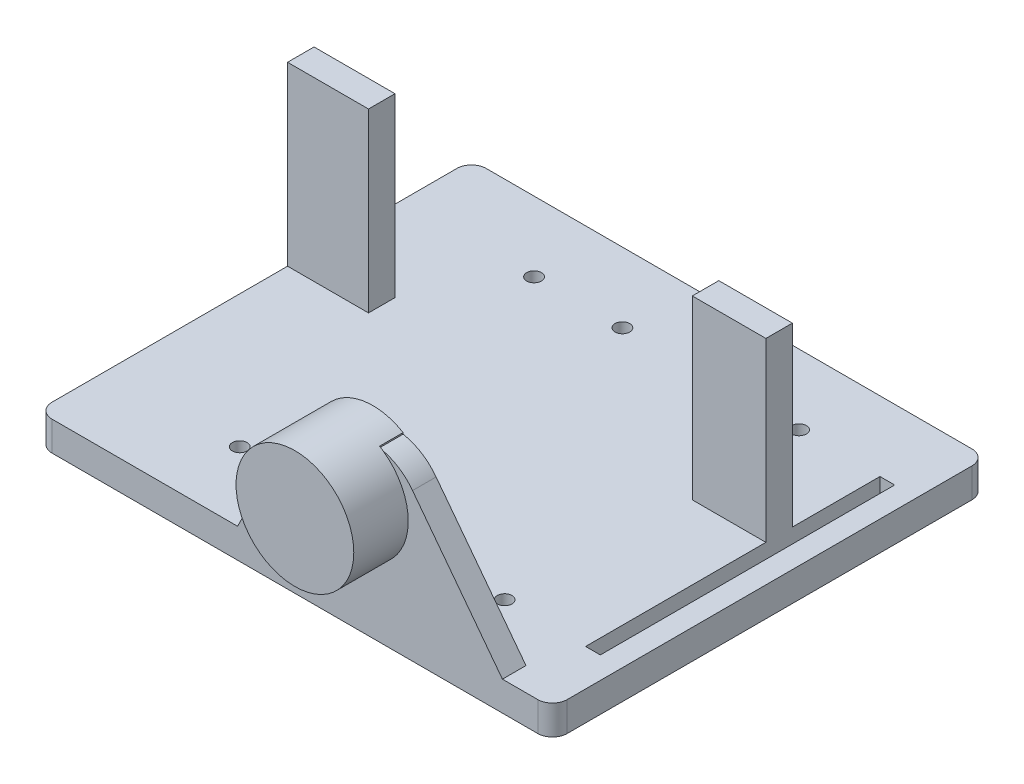
ISO-10303-21;
HEADER;
FILE_DESCRIPTION(('STEP AP214'),'2;1');
FILE_NAME('part.step','',(''),(''),'','','');
FILE_SCHEMA(('AUTOMOTIVE_DESIGN { 1 0 10303 214 1 1 1 1 }'));
ENDSEC;
DATA;
#1=APPLICATION_CONTEXT('core data for automotive mechanical design processes');
#2=APPLICATION_PROTOCOL_DEFINITION('international standard','automotive_design',2000,#1);
#3=PRODUCT_CONTEXT('',#1,'mechanical');
#4=PRODUCT('Part','Part','',(#3));
#5=PRODUCT_RELATED_PRODUCT_CATEGORY('part','',(#4));
#6=PRODUCT_DEFINITION_FORMATION('','',#4);
#7=PRODUCT_DEFINITION_CONTEXT('part definition',#1,'design');
#8=PRODUCT_DEFINITION('design','',#6,#7);
#9=PRODUCT_DEFINITION_SHAPE('','',#8);
#10=(LENGTH_UNIT() NAMED_UNIT(*) SI_UNIT(.MILLI.,.METRE.));
#11=(NAMED_UNIT(*) PLANE_ANGLE_UNIT() SI_UNIT($,.RADIAN.));
#12=(NAMED_UNIT(*) SI_UNIT($,.STERADIAN.) SOLID_ANGLE_UNIT());
#13=UNCERTAINTY_MEASURE_WITH_UNIT(LENGTH_MEASURE(1.E-05),#10,'distance_accuracy_value','');
#14=(GEOMETRIC_REPRESENTATION_CONTEXT(3) GLOBAL_UNCERTAINTY_ASSIGNED_CONTEXT((#13)) GLOBAL_UNIT_ASSIGNED_CONTEXT((#10,
#11,#12)) REPRESENTATION_CONTEXT('',''));
#15=CARTESIAN_POINT('',(0.,0.,0.));
#16=DIRECTION('',(0.,0.,1.));
#17=DIRECTION('',(1.,0.,0.));
#18=AXIS2_PLACEMENT_3D('',#15,#16,#17);
#19=CARTESIAN_POINT('',(5.10000000000002,7.9,13.15));
#20=DIRECTION('',(0.,0.,1.));
#21=DIRECTION('',(1.,0.,0.));
#22=AXIS2_PLACEMENT_3D('',#19,#20,#21);
#23=CYLINDRICAL_SURFACE('',#22,3.6);
#24=CARTESIAN_POINT('',(5.10000000000002,7.9,13.15));
#25=DIRECTION('',(0.,0.,1.));
#26=DIRECTION('',(-1.,0.,0.));
#27=AXIS2_PLACEMENT_3D('',#24,#25,#26);
#28=CIRCLE('',#27,3.6);
#29=CARTESIAN_POINT('',(7.99206413437447,10.043820198306,13.15));
#30=VERTEX_POINT('',#29);
#31=CARTESIAN_POINT('',(5.75081633725553,11.4406832808317,13.15));
#32=VERTEX_POINT('',#31);
#33=EDGE_CURVE('E234',#30,#32,#28,.T.);
#34=ORIENTED_EDGE('',*,*,#33,.T.);
#35=DIRECTION('',(0.,0.,1.));
#36=VECTOR('',#35,1.);
#37=CARTESIAN_POINT('',(5.75081633725553,11.4406832808317,13.15));
#38=LINE('',#37,#36);
#39=CARTESIAN_POINT('',(5.75081633725553,11.4406832808317,14.75));
#40=VERTEX_POINT('',#39);
#41=EDGE_CURVE('E324',#32,#40,#38,.T.);
#42=ORIENTED_EDGE('',*,*,#41,.T.);
#43=CARTESIAN_POINT('',(5.10000000000002,7.9,14.75));
#44=DIRECTION('',(0.,0.,1.));
#45=DIRECTION('',(-1.,0.,0.));
#46=AXIS2_PLACEMENT_3D('',#43,#44,#45);
#47=CIRCLE('',#46,3.6);
#48=CARTESIAN_POINT('',(5.9704543414763,11.3931803903327,14.75));
#49=VERTEX_POINT('',#48);
#50=EDGE_CURVE('E479',#49,#40,#47,.T.);
#51=ORIENTED_EDGE('',*,*,#50,.F.);
#52=CARTESIAN_POINT('',(7.99206413437447,10.043820198306,14.75));
#53=VERTEX_POINT('',#52);
#54=EDGE_CURVE('E475',#53,#49,#47,.T.);
#55=ORIENTED_EDGE('',*,*,#54,.F.);
#56=DIRECTION('',(0.,0.,1.));
#57=VECTOR('',#56,1.);
#58=CARTESIAN_POINT('',(7.99206413437447,10.043820198306,13.15));
#59=LINE('',#58,#57);
#60=EDGE_CURVE('E233',#30,#53,#59,.T.);
#61=ORIENTED_EDGE('',*,*,#60,.F.);
#62=EDGE_LOOP('',(#34,#42,#51,#55,#61));
#63=FACE_BOUND('',#62,.T.);
#64=ADVANCED_FACE('F33',(#63),#23,.T.);
#65=CARTESIAN_POINT('',(3.70000000000003,8.10000000000007,14.75));
#66=DIRECTION('',(0.,0.,1.));
#67=DIRECTION('',(1.,0.,0.));
#68=AXIS2_PLACEMENT_3D('',#65,#66,#67);
#69=PLANE('',#68);
#70=DIRECTION('',(0.,-1.,0.));
#71=VECTOR('',#70,1.);
#72=CARTESIAN_POINT('',(5.75081633725553,11.5342615437451,14.75));
#73=LINE('',#72,#71);
#74=CARTESIAN_POINT('',(5.75081633725553,11.5342615437451,14.75));
#75=VERTEX_POINT('',#74);
#76=EDGE_CURVE('E223',#75,#40,#73,.T.);
#77=ORIENTED_EDGE('',*,*,#76,.F.);
#78=CARTESIAN_POINT('',(3.70000000000003,8.10000000000007,14.75));
#79=DIRECTION('',(0.,0.,1.));
#80=DIRECTION('',(1.,0.,0.));
#81=AXIS2_PLACEMENT_3D('',#78,#79,#80);
#82=CIRCLE('',#81,4.);
#83=EDGE_CURVE('E467',#49,#75,#82,.T.);
#84=ORIENTED_EDGE('',*,*,#83,.F.);
#85=ORIENTED_EDGE('',*,*,#50,.T.);
#86=EDGE_LOOP('',(#77,#84,#85));
#87=FACE_BOUND('',#86,.T.);
#88=ADVANCED_FACE('F486',(#87),#69,.F.);
#89=CARTESIAN_POINT('',(0.,2.,0.));
#90=DIRECTION('',(0.,-1.,0.));
#91=DIRECTION('',(0.,0.,-1.));
#92=AXIS2_PLACEMENT_3D('',#89,#90,#91);
#93=PLANE('',#92);
#94=CARTESIAN_POINT('',(-2.50000000000006,2.,10.));
#95=DIRECTION('',(0.,-1.,0.));
#96=DIRECTION('',(0.,0.,-1.));
#97=AXIS2_PLACEMENT_3D('',#94,#95,#96);
#98=CIRCLE('',#97,0.500490026682158);
#99=CARTESIAN_POINT('',(-2.50000000000006,2.,9.49950997331784));
#100=VERTEX_POINT('',#99);
#101=EDGE_CURVE('E372',#100,#100,#98,.T.);
#102=ORIENTED_EDGE('',*,*,#101,.T.);
#103=EDGE_LOOP('',(#102));
#104=FACE_BOUND('',#103,.T.);
#105=CARTESIAN_POINT('',(9.50000000000002,2.,-10.));
#106=DIRECTION('',(0.,-1.,0.));
#107=DIRECTION('',(0.,0.,-1.));
#108=AXIS2_PLACEMENT_3D('',#105,#106,#107);
#109=CIRCLE('',#108,0.500490026682158);
#110=CARTESIAN_POINT('',(9.50000000000002,2.,-10.5004900266822));
#111=VERTEX_POINT('',#110);
#112=EDGE_CURVE('E369',#111,#111,#109,.T.);
#113=ORIENTED_EDGE('',*,*,#112,.T.);
#114=EDGE_LOOP('',(#113));
#115=FACE_BOUND('',#114,.T.);
#116=CARTESIAN_POINT('',(3.50000000000001,2.,-10.));
#117=DIRECTION('',(0.,-1.,0.));
#118=DIRECTION('',(0.,0.,-1.));
#119=AXIS2_PLACEMENT_3D('',#116,#117,#118);
#120=CIRCLE('',#119,0.500490026682158);
#121=CARTESIAN_POINT('',(3.50000000000001,2.,-10.5004900266822));
#122=VERTEX_POINT('',#121);
#123=EDGE_CURVE('E366',#122,#122,#120,.T.);
#124=ORIENTED_EDGE('',*,*,#123,.T.);
#125=EDGE_LOOP('',(#124));
#126=FACE_BOUND('',#125,.T.);
#127=CARTESIAN_POINT('',(-2.49999999999999,2.,-10.));
#128=DIRECTION('',(0.,-1.,0.));
#129=DIRECTION('',(0.,0.,-1.));
#130=AXIS2_PLACEMENT_3D('',#127,#128,#129);
#131=CIRCLE('',#130,0.500490026682158);
#132=CARTESIAN_POINT('',(-2.49999999999999,2.,-10.5004900266822));
#133=VERTEX_POINT('',#132);
#134=EDGE_CURVE('E363',#133,#133,#131,.T.);
#135=ORIENTED_EDGE('',*,*,#134,.T.);
#136=EDGE_LOOP('',(#135));
#137=FACE_BOUND('',#136,.T.);
#138=CARTESIAN_POINT('',(3.49999999999994,2.,10.));
#139=DIRECTION('',(0.,-1.,0.));
#140=DIRECTION('',(0.,0.,-1.));
#141=AXIS2_PLACEMENT_3D('',#138,#139,#140);
#142=CIRCLE('',#141,0.500490026682158);
#143=CARTESIAN_POINT('',(3.49999999999994,2.,9.49950997331784));
#144=VERTEX_POINT('',#143);
#145=EDGE_CURVE('E360',#144,#144,#142,.T.);
#146=ORIENTED_EDGE('',*,*,#145,.T.);
#147=EDGE_LOOP('',(#146));
#148=FACE_BOUND('',#147,.T.);
#149=CARTESIAN_POINT('',(9.49999999999995,2.,10.));
#150=DIRECTION('',(0.,-1.,0.));
#151=DIRECTION('',(0.,0.,-1.));
#152=AXIS2_PLACEMENT_3D('',#149,#150,#151);
#153=CIRCLE('',#152,0.500490026682158);
#154=CARTESIAN_POINT('',(9.49999999999995,2.,9.49950997331784));
#155=VERTEX_POINT('',#154);
#156=EDGE_CURVE('E357',#155,#155,#153,.T.);
#157=ORIENTED_EDGE('',*,*,#156,.T.);
#158=EDGE_LOOP('',(#157));
#159=FACE_BOUND('',#158,.T.);
#160=CARTESIAN_POINT('',(-8.50000000000006,2.,10.));
#161=DIRECTION('',(0.,-1.,0.));
#162=DIRECTION('',(0.,0.,-1.));
#163=AXIS2_PLACEMENT_3D('',#160,#161,#162);
#164=CIRCLE('',#163,0.500490026682158);
#165=CARTESIAN_POINT('',(-8.50000000000006,2.,9.49950997331784));
#166=VERTEX_POINT('',#165);
#167=EDGE_CURVE('E354',#166,#166,#164,.T.);
#168=ORIENTED_EDGE('',*,*,#167,.T.);
#169=EDGE_LOOP('',(#168));
#170=FACE_BOUND('',#169,.T.);
#171=CARTESIAN_POINT('',(-8.49999999999999,2.,-10.));
#172=DIRECTION('',(0.,-1.,0.));
#173=DIRECTION('',(0.,0.,-1.));
#174=AXIS2_PLACEMENT_3D('',#171,#172,#173);
#175=CIRCLE('',#174,0.500490026682158);
#176=CARTESIAN_POINT('',(-8.49999999999999,2.,-10.5004900266822));
#177=VERTEX_POINT('',#176);
#178=EDGE_CURVE('E351',#177,#177,#175,.T.);
#179=ORIENTED_EDGE('',*,*,#178,.T.);
#180=EDGE_LOOP('',(#179));
#181=FACE_BOUND('',#180,.T.);
#182=DIRECTION('',(0.,0.,-1.));
#183=VECTOR('',#182,1.);
#184=CARTESIAN_POINT('',(17.5,2.,14.75));
#185=LINE('',#184,#183);
#186=CARTESIAN_POINT('',(17.5,2.,13.75));
#187=VERTEX_POINT('',#186);
#188=CARTESIAN_POINT('',(17.5,2.,-13.75));
#189=VERTEX_POINT('',#188);
#190=EDGE_CURVE('E248',#187,#189,#185,.T.);
#191=ORIENTED_EDGE('',*,*,#190,.T.);
#192=CARTESIAN_POINT('',(16.5,2.,-13.75));
#193=DIRECTION('',(0.,-1.,0.));
#194=DIRECTION('',(0.,0.,-1.));
#195=AXIS2_PLACEMENT_3D('',#192,#193,#194);
#196=CIRCLE('',#195,1.);
#197=CARTESIAN_POINT('',(16.5,2.,-14.75));
#198=VERTEX_POINT('',#197);
#199=EDGE_CURVE('E291',#189,#198,#196,.F.);
#200=ORIENTED_EDGE('',*,*,#199,.T.);
#201=DIRECTION('',(-1.,0.,0.));
#202=VECTOR('',#201,1.);
#203=CARTESIAN_POINT('',(-17.5,2.,-14.75));
#204=LINE('',#203,#202);
#205=CARTESIAN_POINT('',(-16.5,2.,-14.75));
#206=VERTEX_POINT('',#205);
#207=EDGE_CURVE('E250',#198,#206,#204,.T.);
#208=ORIENTED_EDGE('',*,*,#207,.T.);
#209=CARTESIAN_POINT('',(-16.5,2.,-13.75));
#210=DIRECTION('',(0.,-1.,0.));
#211=DIRECTION('',(0.,0.,-1.));
#212=AXIS2_PLACEMENT_3D('',#209,#210,#211);
#213=CIRCLE('',#212,1.);
#214=CARTESIAN_POINT('',(-17.5,2.,-13.75));
#215=VERTEX_POINT('',#214);
#216=EDGE_CURVE('E48',#206,#215,#213,.F.);
#217=ORIENTED_EDGE('',*,*,#216,.T.);
#218=DIRECTION('',(0.,0.,1.));
#219=VECTOR('',#218,1.);
#220=CARTESIAN_POINT('',(-17.5,2.,14.75));
#221=LINE('',#220,#219);
#222=CARTESIAN_POINT('',(-17.5,2.,-4.05));
#223=VERTEX_POINT('',#222);
#224=EDGE_CURVE('E254',#215,#223,#221,.T.);
#225=ORIENTED_EDGE('',*,*,#224,.T.);
#226=DIRECTION('',(-1.,0.,0.));
#227=VECTOR('',#226,1.);
#228=CARTESIAN_POINT('',(-17.5,2.,-4.05));
#229=LINE('',#228,#227);
#230=CARTESIAN_POINT('',(-12.,2.,-4.05));
#231=VERTEX_POINT('',#230);
#232=EDGE_CURVE('E443',#231,#223,#229,.T.);
#233=ORIENTED_EDGE('',*,*,#232,.F.);
#234=DIRECTION('',(0.,0.,-1.));
#235=VECTOR('',#234,1.);
#236=CARTESIAN_POINT('',(-12.,2.,-2.25));
#237=LINE('',#236,#235);
#238=CARTESIAN_POINT('',(-12.,2.,-2.25));
#239=VERTEX_POINT('',#238);
#240=EDGE_CURVE('E452',#239,#231,#237,.T.);
#241=ORIENTED_EDGE('',*,*,#240,.F.);
#242=DIRECTION('',(1.,0.,0.));
#243=VECTOR('',#242,1.);
#244=CARTESIAN_POINT('',(-17.5,2.,-2.25));
#245=LINE('',#244,#243);
#246=CARTESIAN_POINT('',(-17.5,2.,-2.25));
#247=VERTEX_POINT('',#246);
#248=EDGE_CURVE('E438',#247,#239,#245,.T.);
#249=ORIENTED_EDGE('',*,*,#248,.F.);
#250=CARTESIAN_POINT('',(-17.5,2.,13.75));
#251=VERTEX_POINT('',#250);
#252=EDGE_CURVE('E253',#247,#251,#221,.T.);
#253=ORIENTED_EDGE('',*,*,#252,.T.);
#254=CARTESIAN_POINT('',(-16.5,2.,13.75));
#255=DIRECTION('',(0.,-1.,0.));
#256=DIRECTION('',(0.,0.,-1.));
#257=AXIS2_PLACEMENT_3D('',#254,#255,#256);
#258=CIRCLE('',#257,1.);
#259=CARTESIAN_POINT('',(-16.5,2.,14.75));
#260=VERTEX_POINT('',#259);
#261=EDGE_CURVE('E287',#251,#260,#258,.F.);
#262=ORIENTED_EDGE('',*,*,#261,.T.);
#263=DIRECTION('',(1.,0.,0.));
#264=VECTOR('',#263,1.);
#265=CARTESIAN_POINT('',(-17.5,2.,14.75));
#266=LINE('',#265,#264);
#267=CARTESIAN_POINT('',(-3.89999999999998,2.,14.75));
#268=VERTEX_POINT('',#267);
#269=EDGE_CURVE('E240',#260,#268,#266,.T.);
#270=ORIENTED_EDGE('',*,*,#269,.T.);
#271=DIRECTION('',(0.,0.,1.));
#272=VECTOR('',#271,1.);
#273=CARTESIAN_POINT('',(-3.89999999999998,2.,13.15));
#274=LINE('',#273,#272);
#275=CARTESIAN_POINT('',(-3.89999999999998,2.,13.15));
#276=VERTEX_POINT('',#275);
#277=EDGE_CURVE('E216',#276,#268,#274,.T.);
#278=ORIENTED_EDGE('',*,*,#277,.F.);
#279=DIRECTION('',(1.,0.,0.));
#280=VECTOR('',#279,1.);
#281=CARTESIAN_POINT('',(14.1,2.,13.15));
#282=LINE('',#281,#280);
#283=CARTESIAN_POINT('',(14.1,2.,13.15));
#284=VERTEX_POINT('',#283);
#285=EDGE_CURVE('E226',#276,#284,#282,.T.);
#286=ORIENTED_EDGE('',*,*,#285,.T.);
#287=DIRECTION('',(0.,0.,1.));
#288=VECTOR('',#287,1.);
#289=CARTESIAN_POINT('',(14.1,2.,13.15));
#290=LINE('',#289,#288);
#291=CARTESIAN_POINT('',(14.1,2.,14.75));
#292=VERTEX_POINT('',#291);
#293=EDGE_CURVE('E241',#284,#292,#290,.T.);
#294=ORIENTED_EDGE('',*,*,#293,.T.);
#295=CARTESIAN_POINT('',(16.5,2.,14.75));
#296=VERTEX_POINT('',#295);
#297=EDGE_CURVE('E256',#292,#296,#266,.T.);
#298=ORIENTED_EDGE('',*,*,#297,.T.);
#299=CARTESIAN_POINT('',(16.5,2.,13.75));
#300=DIRECTION('',(0.,-1.,0.));
#301=DIRECTION('',(0.,0.,-1.));
#302=AXIS2_PLACEMENT_3D('',#299,#300,#301);
#303=CIRCLE('',#302,1.);
#304=EDGE_CURVE('E289',#296,#187,#303,.F.);
#305=ORIENTED_EDGE('',*,*,#304,.T.);
#306=EDGE_LOOP('',(#191,#200,#208,#217,#225,#233,#241,#249,#253,#262,#270,#278,#286,#294,#298,#305));
#307=FACE_BOUND('',#306,.T.);
#308=DIRECTION('',(1.,0.,0.));
#309=VECTOR('',#308,1.);
#310=CARTESIAN_POINT('',(15.,2.,10.));
#311=LINE('',#310,#309);
#312=CARTESIAN_POINT('',(15.,2.,10.));
#313=VERTEX_POINT('',#312);
#314=CARTESIAN_POINT('',(16.,2.,10.));
#315=VERTEX_POINT('',#314);
#316=EDGE_CURVE('E375',#313,#315,#311,.T.);
#317=ORIENTED_EDGE('',*,*,#316,.F.);
#318=DIRECTION('',(0.,0.,1.));
#319=VECTOR('',#318,1.);
#320=CARTESIAN_POINT('',(15.,2.,10.));
#321=LINE('',#320,#319);
#322=CARTESIAN_POINT('',(15.,2.,-2.25));
#323=VERTEX_POINT('',#322);
#324=EDGE_CURVE('E398',#323,#313,#321,.T.);
#325=ORIENTED_EDGE('',*,*,#324,.F.);
#326=DIRECTION('',(1.,0.,0.));
#327=VECTOR('',#326,1.);
#328=CARTESIAN_POINT('',(10.,2.,-2.25));
#329=LINE('',#328,#327);
#330=CARTESIAN_POINT('',(10.,2.,-2.25));
#331=VERTEX_POINT('',#330);
#332=EDGE_CURVE('E413',#331,#323,#329,.T.);
#333=ORIENTED_EDGE('',*,*,#332,.F.);
#334=DIRECTION('',(0.,0.,1.));
#335=VECTOR('',#334,1.);
#336=CARTESIAN_POINT('',(10.,2.,-2.25));
#337=LINE('',#336,#335);
#338=CARTESIAN_POINT('',(10.,2.,-4.05));
#339=VERTEX_POINT('',#338);
#340=EDGE_CURVE('E422',#339,#331,#337,.T.);
#341=ORIENTED_EDGE('',*,*,#340,.F.);
#342=DIRECTION('',(-1.,0.,0.));
#343=VECTOR('',#342,1.);
#344=CARTESIAN_POINT('',(10.,2.,-4.05));
#345=LINE('',#344,#343);
#346=CARTESIAN_POINT('',(15.,2.,-4.05));
#347=VERTEX_POINT('',#346);
#348=EDGE_CURVE('E403',#347,#339,#345,.T.);
#349=ORIENTED_EDGE('',*,*,#348,.F.);
#350=CARTESIAN_POINT('',(15.,2.,-10.));
#351=VERTEX_POINT('',#350);
#352=EDGE_CURVE('E380',#351,#347,#321,.T.);
#353=ORIENTED_EDGE('',*,*,#352,.F.);
#354=DIRECTION('',(-1.,0.,0.));
#355=VECTOR('',#354,1.);
#356=CARTESIAN_POINT('',(15.,2.,-10.));
#357=LINE('',#356,#355);
#358=CARTESIAN_POINT('',(16.,2.,-10.));
#359=VERTEX_POINT('',#358);
#360=EDGE_CURVE('E395',#359,#351,#357,.T.);
#361=ORIENTED_EDGE('',*,*,#360,.F.);
#362=DIRECTION('',(0.,0.,-1.));
#363=VECTOR('',#362,1.);
#364=CARTESIAN_POINT('',(16.,2.,-10.));
#365=LINE('',#364,#363);
#366=EDGE_CURVE('E392',#315,#359,#365,.T.);
#367=ORIENTED_EDGE('',*,*,#366,.F.);
#368=EDGE_LOOP('',(#317,#325,#333,#341,#349,#353,#361,#367));
#369=FACE_BOUND('',#368,.T.);
#370=ADVANCED_FACE('F237',(#104,#115,#126,#137,#148,#159,#170,#181,#307,#369),#93,.F.);
#371=CARTESIAN_POINT('',(17.5,2.,14.75));
#372=DIRECTION('',(-1.,0.,0.));
#373=DIRECTION('',(0.,0.,1.));
#374=AXIS2_PLACEMENT_3D('',#371,#372,#373);
#375=PLANE('',#374);
#376=DIRECTION('',(0.,0.,-1.));
#377=VECTOR('',#376,1.);
#378=CARTESIAN_POINT('',(17.5,0.,14.75));
#379=LINE('',#378,#377);
#380=CARTESIAN_POINT('',(17.5,0.,13.75));
#381=VERTEX_POINT('',#380);
#382=CARTESIAN_POINT('',(17.5,0.,-13.75));
#383=VERTEX_POINT('',#382);
#384=EDGE_CURVE('E243',#381,#383,#379,.T.);
#385=ORIENTED_EDGE('',*,*,#384,.T.);
#386=DIRECTION('',(0.,-1.,0.));
#387=VECTOR('',#386,1.);
#388=CARTESIAN_POINT('',(17.5,2.,-13.75));
#389=LINE('',#388,#387);
#390=EDGE_CURVE('E284',#383,#189,#389,.F.);
#391=ORIENTED_EDGE('',*,*,#390,.T.);
#392=ORIENTED_EDGE('',*,*,#190,.F.);
#393=DIRECTION('',(0.,-1.,0.));
#394=VECTOR('',#393,1.);
#395=CARTESIAN_POINT('',(17.5,2.,13.75));
#396=LINE('',#395,#394);
#397=EDGE_CURVE('E281',#187,#381,#396,.T.);
#398=ORIENTED_EDGE('',*,*,#397,.T.);
#399=EDGE_LOOP('',(#385,#391,#392,#398));
#400=FACE_BOUND('',#399,.T.);
#401=ADVANCED_FACE('F521',(#400),#375,.F.);
#402=CARTESIAN_POINT('',(-17.5,2.,-14.75));
#403=DIRECTION('',(0.,0.,1.));
#404=DIRECTION('',(1.,0.,0.));
#405=AXIS2_PLACEMENT_3D('',#402,#403,#404);
#406=PLANE('',#405);
#407=ORIENTED_EDGE('',*,*,#207,.F.);
#408=DIRECTION('',(0.,-1.,0.));
#409=VECTOR('',#408,1.);
#410=CARTESIAN_POINT('',(16.5,2.,-14.75));
#411=LINE('',#410,#409);
#412=CARTESIAN_POINT('',(16.5,0.,-14.75));
#413=VERTEX_POINT('',#412);
#414=EDGE_CURVE('E270',#198,#413,#411,.T.);
#415=ORIENTED_EDGE('',*,*,#414,.T.);
#416=DIRECTION('',(-1.,0.,0.));
#417=VECTOR('',#416,1.);
#418=CARTESIAN_POINT('',(-17.5,0.,-14.75));
#419=LINE('',#418,#417);
#420=CARTESIAN_POINT('',(-16.5,0.,-14.75));
#421=VERTEX_POINT('',#420);
#422=EDGE_CURVE('E261',#413,#421,#419,.T.);
#423=ORIENTED_EDGE('',*,*,#422,.T.);
#424=DIRECTION('',(0.,-1.,0.));
#425=VECTOR('',#424,1.);
#426=CARTESIAN_POINT('',(-16.5,2.,-14.75));
#427=LINE('',#426,#425);
#428=EDGE_CURVE('E268',#421,#206,#427,.F.);
#429=ORIENTED_EDGE('',*,*,#428,.T.);
#430=EDGE_LOOP('',(#407,#415,#423,#429));
#431=FACE_BOUND('',#430,.T.);
#432=ADVANCED_FACE('F530',(#431),#406,.F.);
#433=CARTESIAN_POINT('',(-17.5,2.,14.75));
#434=DIRECTION('',(1.,0.,0.));
#435=DIRECTION('',(0.,0.,-1.));
#436=AXIS2_PLACEMENT_3D('',#433,#434,#435);
#437=PLANE('',#436);
#438=DIRECTION('',(0.,0.,1.));
#439=VECTOR('',#438,1.);
#440=CARTESIAN_POINT('',(-17.5,0.,14.75));
#441=LINE('',#440,#439);
#442=CARTESIAN_POINT('',(-17.5,0.,-13.75));
#443=VERTEX_POINT('',#442);
#444=CARTESIAN_POINT('',(-17.5,0.,13.75));
#445=VERTEX_POINT('',#444);
#446=EDGE_CURVE('E264',#443,#445,#441,.T.);
#447=ORIENTED_EDGE('',*,*,#446,.T.);
#448=DIRECTION('',(0.,-1.,0.));
#449=VECTOR('',#448,1.);
#450=CARTESIAN_POINT('',(-17.5,2.,13.75));
#451=LINE('',#450,#449);
#452=EDGE_CURVE('E11',#445,#251,#451,.F.);
#453=ORIENTED_EDGE('',*,*,#452,.T.);
#454=ORIENTED_EDGE('',*,*,#252,.F.);
#455=DIRECTION('',(0.,-1.,0.));
#456=VECTOR('',#455,1.);
#457=CARTESIAN_POINT('',(-17.5,14.,-2.25));
#458=LINE('',#457,#456);
#459=CARTESIAN_POINT('',(-17.5,14.,-2.25));
#460=VERTEX_POINT('',#459);
#461=EDGE_CURVE('E464',#460,#247,#458,.T.);
#462=ORIENTED_EDGE('',*,*,#461,.F.);
#463=DIRECTION('',(0.,0.,1.));
#464=VECTOR('',#463,1.);
#465=CARTESIAN_POINT('',(-17.5,14.,-2.25));
#466=LINE('',#465,#464);
#467=CARTESIAN_POINT('',(-17.5,14.,-4.05));
#468=VERTEX_POINT('',#467);
#469=EDGE_CURVE('E439',#468,#460,#466,.T.);
#470=ORIENTED_EDGE('',*,*,#469,.F.);
#471=DIRECTION('',(0.,-1.,0.));
#472=VECTOR('',#471,1.);
#473=CARTESIAN_POINT('',(-17.5,14.,-4.05));
#474=LINE('',#473,#472);
#475=EDGE_CURVE('E449',#468,#223,#474,.T.);
#476=ORIENTED_EDGE('',*,*,#475,.T.);
#477=ORIENTED_EDGE('',*,*,#224,.F.);
#478=DIRECTION('',(0.,-1.,0.));
#479=VECTOR('',#478,1.);
#480=CARTESIAN_POINT('',(-17.5,2.,-13.75));
#481=LINE('',#480,#479);
#482=EDGE_CURVE('E41',#215,#443,#481,.T.);
#483=ORIENTED_EDGE('',*,*,#482,.T.);
#484=EDGE_LOOP('',(#447,#453,#454,#462,#470,#476,#477,#483));
#485=FACE_BOUND('',#484,.T.);
#486=ADVANCED_FACE('F300',(#485),#437,.F.);
#487=CARTESIAN_POINT('',(-17.5,2.,14.75));
#488=DIRECTION('',(0.,0.,-1.));
#489=DIRECTION('',(-1.,0.,0.));
#490=AXIS2_PLACEMENT_3D('',#487,#488,#489);
#491=PLANE('',#490);
#492=CARTESIAN_POINT('',(0.0522292944323392,9.7412705077477,14.75));
#493=VERTEX_POINT('',#492);
#494=EDGE_CURVE('E258',#493,#49,#82,.T.);
#495=ORIENTED_EDGE('',*,*,#494,.F.);
#496=DIRECTION('',(0.45470780974407,0.890640672638383,0.));
#497=VECTOR('',#496,1.);
#498=CARTESIAN_POINT('',(-3.89999999999998,2.,14.75));
#499=LINE('',#498,#497);
#500=EDGE_CURVE('E313',#268,#493,#499,.T.);
#501=ORIENTED_EDGE('',*,*,#500,.F.);
#502=ORIENTED_EDGE('',*,*,#269,.F.);
#503=DIRECTION('',(0.,-1.,0.));
#504=VECTOR('',#503,1.);
#505=CARTESIAN_POINT('',(-16.5,2.,14.75));
#506=LINE('',#505,#504);
#507=CARTESIAN_POINT('',(-16.5,0.,14.75));
#508=VERTEX_POINT('',#507);
#509=EDGE_CURVE('E293',#260,#508,#506,.T.);
#510=ORIENTED_EDGE('',*,*,#509,.T.);
#511=DIRECTION('',(1.,0.,0.));
#512=VECTOR('',#511,1.);
#513=CARTESIAN_POINT('',(-17.5,0.,14.75));
#514=LINE('',#513,#512);
#515=CARTESIAN_POINT('',(16.5,0.,14.75));
#516=VERTEX_POINT('',#515);
#517=EDGE_CURVE('E251',#508,#516,#514,.T.);
#518=ORIENTED_EDGE('',*,*,#517,.T.);
#519=DIRECTION('',(0.,-1.,0.));
#520=VECTOR('',#519,1.);
#521=CARTESIAN_POINT('',(16.5,2.,14.75));
#522=LINE('',#521,#520);
#523=EDGE_CURVE('E56',#516,#296,#522,.F.);
#524=ORIENTED_EDGE('',*,*,#523,.T.);
#525=ORIENTED_EDGE('',*,*,#297,.F.);
#526=DIRECTION('',(-0.604746350818441,0.796418138399534,0.));
#527=VECTOR('',#526,1.);
#528=CARTESIAN_POINT('',(14.1,2.,14.75));
#529=LINE('',#528,#527);
#530=EDGE_CURVE('E471',#292,#53,#529,.T.);
#531=ORIENTED_EDGE('',*,*,#530,.T.);
#532=ORIENTED_EDGE('',*,*,#54,.T.);
#533=EDGE_LOOP('',(#495,#501,#502,#510,#518,#524,#525,#531,#532));
#534=FACE_BOUND('',#533,.T.);
#535=ADVANCED_FACE('F312',(#534),#491,.F.);
#536=CARTESIAN_POINT('',(0.,0.,0.));
#537=DIRECTION('',(0.,-1.,0.));
#538=DIRECTION('',(0.,0.,-1.));
#539=AXIS2_PLACEMENT_3D('',#536,#537,#538);
#540=PLANE('',#539);
#541=CARTESIAN_POINT('',(-2.50000000000006,0.,10.));
#542=DIRECTION('',(0.,-1.,0.));
#543=DIRECTION('',(0.,0.,-1.));
#544=AXIS2_PLACEMENT_3D('',#541,#542,#543);
#545=CIRCLE('',#544,0.500490026682158);
#546=CARTESIAN_POINT('',(-2.50000000000006,0.,9.49950997331784));
#547=VERTEX_POINT('',#546);
#548=EDGE_CURVE('E331',#547,#547,#545,.T.);
#549=ORIENTED_EDGE('',*,*,#548,.F.);
#550=EDGE_LOOP('',(#549));
#551=FACE_BOUND('',#550,.T.);
#552=CARTESIAN_POINT('',(9.50000000000002,0.,-10.));
#553=DIRECTION('',(0.,-1.,0.));
#554=DIRECTION('',(0.,0.,-1.));
#555=AXIS2_PLACEMENT_3D('',#552,#553,#554);
#556=CIRCLE('',#555,0.500490026682158);
#557=CARTESIAN_POINT('',(9.50000000000002,0.,-10.5004900266822));
#558=VERTEX_POINT('',#557);
#559=EDGE_CURVE('E337',#558,#558,#556,.T.);
#560=ORIENTED_EDGE('',*,*,#559,.F.);
#561=EDGE_LOOP('',(#560));
#562=FACE_BOUND('',#561,.T.);
#563=CARTESIAN_POINT('',(3.50000000000001,0.,-10.));
#564=DIRECTION('',(0.,-1.,0.));
#565=DIRECTION('',(0.,0.,-1.));
#566=AXIS2_PLACEMENT_3D('',#563,#564,#565);
#567=CIRCLE('',#566,0.500490026682158);
#568=CARTESIAN_POINT('',(3.50000000000001,0.,-10.5004900266822));
#569=VERTEX_POINT('',#568);
#570=EDGE_CURVE('E340',#569,#569,#567,.T.);
#571=ORIENTED_EDGE('',*,*,#570,.F.);
#572=EDGE_LOOP('',(#571));
#573=FACE_BOUND('',#572,.T.);
#574=CARTESIAN_POINT('',(-2.49999999999999,0.,-10.));
#575=DIRECTION('',(0.,-1.,0.));
#576=DIRECTION('',(0.,0.,-1.));
#577=AXIS2_PLACEMENT_3D('',#574,#575,#576);
#578=CIRCLE('',#577,0.500490026682158);
#579=CARTESIAN_POINT('',(-2.49999999999999,0.,-10.5004900266822));
#580=VERTEX_POINT('',#579);
#581=EDGE_CURVE('E343',#580,#580,#578,.T.);
#582=ORIENTED_EDGE('',*,*,#581,.F.);
#583=EDGE_LOOP('',(#582));
#584=FACE_BOUND('',#583,.T.);
#585=CARTESIAN_POINT('',(3.49999999999994,0.,10.));
#586=DIRECTION('',(0.,-1.,0.));
#587=DIRECTION('',(0.,0.,-1.));
#588=AXIS2_PLACEMENT_3D('',#585,#586,#587);
#589=CIRCLE('',#588,0.500490026682158);
#590=CARTESIAN_POINT('',(3.49999999999994,0.,9.49950997331784));
#591=VERTEX_POINT('',#590);
#592=EDGE_CURVE('E328',#591,#591,#589,.T.);
#593=ORIENTED_EDGE('',*,*,#592,.F.);
#594=EDGE_LOOP('',(#593));
#595=FACE_BOUND('',#594,.T.);
#596=CARTESIAN_POINT('',(9.49999999999995,0.,10.));
#597=DIRECTION('',(0.,-1.,0.));
#598=DIRECTION('',(0.,0.,-1.));
#599=AXIS2_PLACEMENT_3D('',#596,#597,#598);
#600=CIRCLE('',#599,0.500490026682158);
#601=CARTESIAN_POINT('',(9.49999999999995,0.,9.49950997331784));
#602=VERTEX_POINT('',#601);
#603=EDGE_CURVE('E332',#602,#602,#600,.T.);
#604=ORIENTED_EDGE('',*,*,#603,.F.);
#605=EDGE_LOOP('',(#604));
#606=FACE_BOUND('',#605,.T.);
#607=CARTESIAN_POINT('',(-8.50000000000006,0.,10.));
#608=DIRECTION('',(0.,-1.,0.));
#609=DIRECTION('',(0.,0.,-1.));
#610=AXIS2_PLACEMENT_3D('',#607,#608,#609);
#611=CIRCLE('',#610,0.500490026682158);
#612=CARTESIAN_POINT('',(-8.50000000000006,0.,9.49950997331784));
#613=VERTEX_POINT('',#612);
#614=EDGE_CURVE('E327',#613,#613,#611,.T.);
#615=ORIENTED_EDGE('',*,*,#614,.F.);
#616=EDGE_LOOP('',(#615));
#617=FACE_BOUND('',#616,.T.);
#618=CARTESIAN_POINT('',(-8.49999999999999,0.,-10.));
#619=DIRECTION('',(0.,-1.,0.));
#620=DIRECTION('',(0.,0.,-1.));
#621=AXIS2_PLACEMENT_3D('',#618,#619,#620);
#622=CIRCLE('',#621,0.500490026682158);
#623=CARTESIAN_POINT('',(-8.49999999999999,0.,-10.5004900266822));
#624=VERTEX_POINT('',#623);
#625=EDGE_CURVE('E346',#624,#624,#622,.T.);
#626=ORIENTED_EDGE('',*,*,#625,.F.);
#627=EDGE_LOOP('',(#626));
#628=FACE_BOUND('',#627,.T.);
#629=DIRECTION('',(1.,0.,0.));
#630=VECTOR('',#629,1.);
#631=CARTESIAN_POINT('',(15.,0.,10.));
#632=LINE('',#631,#630);
#633=CARTESIAN_POINT('',(15.,0.,10.));
#634=VERTEX_POINT('',#633);
#635=CARTESIAN_POINT('',(16.,0.,10.));
#636=VERTEX_POINT('',#635);
#637=EDGE_CURVE('E376',#634,#636,#632,.T.);
#638=ORIENTED_EDGE('',*,*,#637,.T.);
#639=DIRECTION('',(0.,0.,-1.));
#640=VECTOR('',#639,1.);
#641=CARTESIAN_POINT('',(16.,0.,-10.));
#642=LINE('',#641,#640);
#643=CARTESIAN_POINT('',(16.,0.,-10.));
#644=VERTEX_POINT('',#643);
#645=EDGE_CURVE('E379',#636,#644,#642,.T.);
#646=ORIENTED_EDGE('',*,*,#645,.T.);
#647=DIRECTION('',(-1.,0.,0.));
#648=VECTOR('',#647,1.);
#649=CARTESIAN_POINT('',(15.,0.,-10.));
#650=LINE('',#649,#648);
#651=CARTESIAN_POINT('',(15.,0.,-10.));
#652=VERTEX_POINT('',#651);
#653=EDGE_CURVE('E383',#644,#652,#650,.T.);
#654=ORIENTED_EDGE('',*,*,#653,.T.);
#655=DIRECTION('',(0.,0.,1.));
#656=VECTOR('',#655,1.);
#657=CARTESIAN_POINT('',(15.,0.,10.));
#658=LINE('',#657,#656);
#659=EDGE_CURVE('E386',#652,#634,#658,.T.);
#660=ORIENTED_EDGE('',*,*,#659,.T.);
#661=EDGE_LOOP('',(#638,#646,#654,#660));
#662=FACE_BOUND('',#661,.T.);
#663=ORIENTED_EDGE('',*,*,#422,.F.);
#664=CARTESIAN_POINT('',(16.5,0.,-13.75));
#665=DIRECTION('',(0.,-1.,0.));
#666=DIRECTION('',(0.,0.,-1.));
#667=AXIS2_PLACEMENT_3D('',#664,#665,#666);
#668=CIRCLE('',#667,1.);
#669=EDGE_CURVE('E279',#413,#383,#668,.T.);
#670=ORIENTED_EDGE('',*,*,#669,.T.);
#671=ORIENTED_EDGE('',*,*,#384,.F.);
#672=CARTESIAN_POINT('',(16.5,0.,13.75));
#673=DIRECTION('',(0.,-1.,0.));
#674=DIRECTION('',(0.,0.,-1.));
#675=AXIS2_PLACEMENT_3D('',#672,#673,#674);
#676=CIRCLE('',#675,1.);
#677=EDGE_CURVE('E277',#381,#516,#676,.T.);
#678=ORIENTED_EDGE('',*,*,#677,.T.);
#679=ORIENTED_EDGE('',*,*,#517,.F.);
#680=CARTESIAN_POINT('',(-16.5,0.,13.75));
#681=DIRECTION('',(0.,-1.,0.));
#682=DIRECTION('',(0.,0.,-1.));
#683=AXIS2_PLACEMENT_3D('',#680,#681,#682);
#684=CIRCLE('',#683,1.);
#685=EDGE_CURVE('E275',#508,#445,#684,.T.);
#686=ORIENTED_EDGE('',*,*,#685,.T.);
#687=ORIENTED_EDGE('',*,*,#446,.F.);
#688=CARTESIAN_POINT('',(-16.5,0.,-13.75));
#689=DIRECTION('',(0.,-1.,0.));
#690=DIRECTION('',(0.,0.,-1.));
#691=AXIS2_PLACEMENT_3D('',#688,#689,#690);
#692=CIRCLE('',#691,1.);
#693=EDGE_CURVE('E273',#443,#421,#692,.T.);
#694=ORIENTED_EDGE('',*,*,#693,.T.);
#695=EDGE_LOOP('',(#663,#670,#671,#678,#679,#686,#687,#694));
#696=FACE_BOUND('',#695,.T.);
#697=ADVANCED_FACE('F306',(#551,#562,#573,#584,#595,#606,#617,#628,#662,#696),#540,.T.);
#698=CARTESIAN_POINT('',(14.1,2.,13.15));
#699=DIRECTION('',(0.796418138399534,0.604746350818441,0.));
#700=DIRECTION('',(-0.604746350818441,0.796418138399534,0.));
#701=AXIS2_PLACEMENT_3D('',#698,#699,#700);
#702=PLANE('',#701);
#703=ORIENTED_EDGE('',*,*,#530,.F.);
#704=ORIENTED_EDGE('',*,*,#293,.F.);
#705=DIRECTION('',(-0.604746350818441,0.796418138399534,0.));
#706=VECTOR('',#705,1.);
#707=CARTESIAN_POINT('',(14.1,2.,13.15));
#708=LINE('',#707,#706);
#709=EDGE_CURVE('E230',#284,#30,#708,.T.);
#710=ORIENTED_EDGE('',*,*,#709,.T.);
#711=ORIENTED_EDGE('',*,*,#60,.T.);
#712=EDGE_LOOP('',(#703,#704,#710,#711));
#713=FACE_BOUND('',#712,.T.);
#714=ADVANCED_FACE('F506',(#713),#702,.T.);
#715=CARTESIAN_POINT('',(5.10000000000002,7.9,13.15));
#716=DIRECTION('',(0.,0.,-1.));
#717=DIRECTION('',(-1.,0.,0.));
#718=AXIS2_PLACEMENT_3D('',#715,#716,#717);
#719=PLANE('',#718);
#720=ORIENTED_EDGE('',*,*,#285,.F.);
#721=DIRECTION('',(0.45470780974407,0.890640672638383,0.));
#722=VECTOR('',#721,1.);
#723=CARTESIAN_POINT('',(-3.89999999999998,2.,13.15));
#724=LINE('',#723,#722);
#725=CARTESIAN_POINT('',(0.0522292944323392,9.7412705077477,13.15));
#726=VERTEX_POINT('',#725);
#727=EDGE_CURVE('E211',#276,#726,#724,.T.);
#728=ORIENTED_EDGE('',*,*,#727,.T.);
#729=CARTESIAN_POINT('',(3.70000000000003,8.10000000000007,13.15));
#730=DIRECTION('',(0.,0.,-1.));
#731=DIRECTION('',(-1.,0.,0.));
#732=AXIS2_PLACEMENT_3D('',#729,#730,#731);
#733=CIRCLE('',#732,4.);
#734=CARTESIAN_POINT('',(5.75081633725553,11.5342615437451,13.15));
#735=VERTEX_POINT('',#734);
#736=EDGE_CURVE('E222',#726,#735,#733,.T.);
#737=ORIENTED_EDGE('',*,*,#736,.T.);
#738=DIRECTION('',(0.,-1.,0.));
#739=VECTOR('',#738,1.);
#740=CARTESIAN_POINT('',(5.75081633725553,11.5342615437451,13.15));
#741=LINE('',#740,#739);
#742=EDGE_CURVE('E318',#735,#32,#741,.T.);
#743=ORIENTED_EDGE('',*,*,#742,.T.);
#744=ORIENTED_EDGE('',*,*,#33,.F.);
#745=ORIENTED_EDGE('',*,*,#709,.F.);
#746=EDGE_LOOP('',(#720,#728,#737,#743,#744,#745));
#747=FACE_BOUND('',#746,.T.);
#748=ADVANCED_FACE('F227',(#747),#719,.T.);
#749=CARTESIAN_POINT('',(3.70000000000003,8.10000000000007,18.45));
#750=DIRECTION('',(0.,0.,-1.));
#751=DIRECTION('',(-1.,0.,0.));
#752=AXIS2_PLACEMENT_3D('',#749,#750,#751);
#753=CYLINDRICAL_SURFACE('',#752,4.);
#754=CARTESIAN_POINT('',(3.70000000000003,8.10000000000007,18.45));
#755=DIRECTION('',(0.,0.,1.));
#756=DIRECTION('',(1.,0.,0.));
#757=AXIS2_PLACEMENT_3D('',#754,#755,#756);
#758=CIRCLE('',#757,4.);
#759=CARTESIAN_POINT('',(7.70000000000003,8.10000000000007,18.45));
#760=VERTEX_POINT('',#759);
#761=EDGE_CURVE('E468',#760,#760,#758,.T.);
#762=ORIENTED_EDGE('',*,*,#761,.F.);
#763=EDGE_LOOP('',(#762));
#764=FACE_BOUND('',#763,.T.);
#765=ORIENTED_EDGE('',*,*,#83,.T.);
#766=DIRECTION('',(0.,0.,1.));
#767=VECTOR('',#766,1.);
#768=CARTESIAN_POINT('',(5.75081633725553,11.5342615437451,13.15));
#769=LINE('',#768,#767);
#770=EDGE_CURVE('E321',#735,#75,#769,.T.);
#771=ORIENTED_EDGE('',*,*,#770,.F.);
#772=ORIENTED_EDGE('',*,*,#736,.F.);
#773=DIRECTION('',(0.,0.,1.));
#774=VECTOR('',#773,1.);
#775=CARTESIAN_POINT('',(0.0522292944323392,9.7412705077477,13.15));
#776=LINE('',#775,#774);
#777=EDGE_CURVE('E219',#726,#493,#776,.T.);
#778=ORIENTED_EDGE('',*,*,#777,.T.);
#779=ORIENTED_EDGE('',*,*,#494,.T.);
#780=EDGE_LOOP('',(#765,#771,#772,#778,#779));
#781=FACE_BOUND('',#780,.T.);
#782=ADVANCED_FACE('F494',(#764,#781),#753,.T.);
#783=CARTESIAN_POINT('',(3.70000000000003,8.10000000000007,18.45));
#784=DIRECTION('',(0.,0.,1.));
#785=DIRECTION('',(1.,0.,0.));
#786=AXIS2_PLACEMENT_3D('',#783,#784,#785);
#787=PLANE('',#786);
#788=ORIENTED_EDGE('',*,*,#761,.T.);
#789=EDGE_LOOP('',(#788));
#790=FACE_BOUND('',#789,.T.);
#791=ADVANCED_FACE('F496',(#790),#787,.T.);
#792=CARTESIAN_POINT('',(-17.5,14.,-2.25));
#793=DIRECTION('',(0.,0.,-1.));
#794=DIRECTION('',(-1.,0.,0.));
#795=AXIS2_PLACEMENT_3D('',#792,#793,#794);
#796=PLANE('',#795);
#797=ORIENTED_EDGE('',*,*,#248,.T.);
#798=DIRECTION('',(0.,-1.,0.));
#799=VECTOR('',#798,1.);
#800=CARTESIAN_POINT('',(-12.,14.,-2.25));
#801=LINE('',#800,#799);
#802=CARTESIAN_POINT('',(-12.,14.,-2.25));
#803=VERTEX_POINT('',#802);
#804=EDGE_CURVE('E461',#803,#239,#801,.T.);
#805=ORIENTED_EDGE('',*,*,#804,.F.);
#806=DIRECTION('',(1.,0.,0.));
#807=VECTOR('',#806,1.);
#808=CARTESIAN_POINT('',(-17.5,14.,-2.25));
#809=LINE('',#808,#807);
#810=EDGE_CURVE('E442',#460,#803,#809,.T.);
#811=ORIENTED_EDGE('',*,*,#810,.F.);
#812=ORIENTED_EDGE('',*,*,#461,.T.);
#813=EDGE_LOOP('',(#797,#805,#811,#812));
#814=FACE_BOUND('',#813,.T.);
#815=ADVANCED_FACE('F503',(#814),#796,.F.);
#816=CARTESIAN_POINT('',(-12.,14.,-2.25));
#817=DIRECTION('',(-1.,0.,0.));
#818=DIRECTION('',(0.,0.,1.));
#819=AXIS2_PLACEMENT_3D('',#816,#817,#818);
#820=PLANE('',#819);
#821=ORIENTED_EDGE('',*,*,#240,.T.);
#822=DIRECTION('',(0.,-1.,0.));
#823=VECTOR('',#822,1.);
#824=CARTESIAN_POINT('',(-12.,14.,-4.05));
#825=LINE('',#824,#823);
#826=CARTESIAN_POINT('',(-12.,14.,-4.05));
#827=VERTEX_POINT('',#826);
#828=EDGE_CURVE('E458',#827,#231,#825,.T.);
#829=ORIENTED_EDGE('',*,*,#828,.F.);
#830=DIRECTION('',(0.,0.,-1.));
#831=VECTOR('',#830,1.);
#832=CARTESIAN_POINT('',(-12.,14.,-2.25));
#833=LINE('',#832,#831);
#834=EDGE_CURVE('E445',#803,#827,#833,.T.);
#835=ORIENTED_EDGE('',*,*,#834,.F.);
#836=ORIENTED_EDGE('',*,*,#804,.T.);
#837=EDGE_LOOP('',(#821,#829,#835,#836));
#838=FACE_BOUND('',#837,.T.);
#839=ADVANCED_FACE('F637',(#838),#820,.F.);
#840=CARTESIAN_POINT('',(-17.5,14.,-4.05));
#841=DIRECTION('',(0.,0.,1.));
#842=DIRECTION('',(1.,0.,0.));
#843=AXIS2_PLACEMENT_3D('',#840,#841,#842);
#844=PLANE('',#843);
#845=ORIENTED_EDGE('',*,*,#232,.T.);
#846=ORIENTED_EDGE('',*,*,#475,.F.);
#847=DIRECTION('',(-1.,0.,0.));
#848=VECTOR('',#847,1.);
#849=CARTESIAN_POINT('',(-17.5,14.,-4.05));
#850=LINE('',#849,#848);
#851=EDGE_CURVE('E447',#827,#468,#850,.T.);
#852=ORIENTED_EDGE('',*,*,#851,.F.);
#853=ORIENTED_EDGE('',*,*,#828,.T.);
#854=EDGE_LOOP('',(#845,#846,#852,#853));
#855=FACE_BOUND('',#854,.T.);
#856=ADVANCED_FACE('F633',(#855),#844,.F.);
#857=CARTESIAN_POINT('',(0.,14.,0.));
#858=DIRECTION('',(0.,-1.,0.));
#859=DIRECTION('',(0.,0.,-1.));
#860=AXIS2_PLACEMENT_3D('',#857,#858,#859);
#861=PLANE('',#860);
#862=ORIENTED_EDGE('',*,*,#469,.T.);
#863=ORIENTED_EDGE('',*,*,#810,.T.);
#864=ORIENTED_EDGE('',*,*,#834,.T.);
#865=ORIENTED_EDGE('',*,*,#851,.T.);
#866=EDGE_LOOP('',(#862,#863,#864,#865));
#867=FACE_BOUND('',#866,.T.);
#868=ADVANCED_FACE('F629',(#867),#861,.F.);
#869=CARTESIAN_POINT('',(15.,14.,-2.25));
#870=DIRECTION('',(-1.,0.,0.));
#871=DIRECTION('',(0.,0.,1.));
#872=AXIS2_PLACEMENT_3D('',#869,#870,#871);
#873=PLANE('',#872);
#874=DIRECTION('',(0.,-1.,0.));
#875=VECTOR('',#874,1.);
#876=CARTESIAN_POINT('',(15.,14.,-2.25));
#877=LINE('',#876,#875);
#878=CARTESIAN_POINT('',(15.,14.,-2.25));
#879=VERTEX_POINT('',#878);
#880=EDGE_CURVE('E419',#879,#323,#877,.T.);
#881=ORIENTED_EDGE('',*,*,#880,.T.);
#882=ORIENTED_EDGE('',*,*,#324,.T.);
#883=DIRECTION('',(0.,1.,0.));
#884=VECTOR('',#883,1.);
#885=CARTESIAN_POINT('',(15.,0.,10.));
#886=LINE('',#885,#884);
#887=EDGE_CURVE('E400',#634,#313,#886,.T.);
#888=ORIENTED_EDGE('',*,*,#887,.F.);
#889=ORIENTED_EDGE('',*,*,#659,.F.);
#890=DIRECTION('',(0.,1.,0.));
#891=VECTOR('',#890,1.);
#892=CARTESIAN_POINT('',(15.,0.,-10.));
#893=LINE('',#892,#891);
#894=EDGE_CURVE('E404',#652,#351,#893,.T.);
#895=ORIENTED_EDGE('',*,*,#894,.T.);
#896=ORIENTED_EDGE('',*,*,#352,.T.);
#897=DIRECTION('',(0.,-1.,0.));
#898=VECTOR('',#897,1.);
#899=CARTESIAN_POINT('',(15.,14.,-4.05));
#900=LINE('',#899,#898);
#901=CARTESIAN_POINT('',(15.,14.,-4.05));
#902=VERTEX_POINT('',#901);
#903=EDGE_CURVE('E435',#902,#347,#900,.T.);
#904=ORIENTED_EDGE('',*,*,#903,.F.);
#905=DIRECTION('',(0.,0.,-1.));
#906=VECTOR('',#905,1.);
#907=CARTESIAN_POINT('',(15.,14.,-2.25));
#908=LINE('',#907,#906);
#909=EDGE_CURVE('E409',#879,#902,#908,.T.);
#910=ORIENTED_EDGE('',*,*,#909,.F.);
#911=EDGE_LOOP('',(#881,#882,#888,#889,#895,#896,#904,#910));
#912=FACE_BOUND('',#911,.T.);
#913=ADVANCED_FACE('F625',(#912),#873,.F.);
#914=CARTESIAN_POINT('',(10.,14.,-4.05));
#915=DIRECTION('',(0.,0.,1.));
#916=DIRECTION('',(1.,0.,0.));
#917=AXIS2_PLACEMENT_3D('',#914,#915,#916);
#918=PLANE('',#917);
#919=ORIENTED_EDGE('',*,*,#348,.T.);
#920=DIRECTION('',(0.,-1.,0.));
#921=VECTOR('',#920,1.);
#922=CARTESIAN_POINT('',(10.,14.,-4.05));
#923=LINE('',#922,#921);
#924=CARTESIAN_POINT('',(10.,14.,-4.05));
#925=VERTEX_POINT('',#924);
#926=EDGE_CURVE('E432',#925,#339,#923,.T.);
#927=ORIENTED_EDGE('',*,*,#926,.F.);
#928=DIRECTION('',(-1.,0.,0.));
#929=VECTOR('',#928,1.);
#930=CARTESIAN_POINT('',(10.,14.,-4.05));
#931=LINE('',#930,#929);
#932=EDGE_CURVE('E412',#902,#925,#931,.T.);
#933=ORIENTED_EDGE('',*,*,#932,.F.);
#934=ORIENTED_EDGE('',*,*,#903,.T.);
#935=EDGE_LOOP('',(#919,#927,#933,#934));
#936=FACE_BOUND('',#935,.T.);
#937=ADVANCED_FACE('F621',(#936),#918,.F.);
#938=CARTESIAN_POINT('',(10.,14.,-2.25));
#939=DIRECTION('',(1.,0.,0.));
#940=DIRECTION('',(0.,0.,-1.));
#941=AXIS2_PLACEMENT_3D('',#938,#939,#940);
#942=PLANE('',#941);
#943=ORIENTED_EDGE('',*,*,#340,.T.);
#944=DIRECTION('',(0.,-1.,0.));
#945=VECTOR('',#944,1.);
#946=CARTESIAN_POINT('',(10.,14.,-2.25));
#947=LINE('',#946,#945);
#948=CARTESIAN_POINT('',(10.,14.,-2.25));
#949=VERTEX_POINT('',#948);
#950=EDGE_CURVE('E429',#949,#331,#947,.T.);
#951=ORIENTED_EDGE('',*,*,#950,.F.);
#952=DIRECTION('',(0.,0.,1.));
#953=VECTOR('',#952,1.);
#954=CARTESIAN_POINT('',(10.,14.,-2.25));
#955=LINE('',#954,#953);
#956=EDGE_CURVE('E415',#925,#949,#955,.T.);
#957=ORIENTED_EDGE('',*,*,#956,.F.);
#958=ORIENTED_EDGE('',*,*,#926,.T.);
#959=EDGE_LOOP('',(#943,#951,#957,#958));
#960=FACE_BOUND('',#959,.T.);
#961=ADVANCED_FACE('F617',(#960),#942,.F.);
#962=CARTESIAN_POINT('',(10.,14.,-2.25));
#963=DIRECTION('',(0.,0.,-1.));
#964=DIRECTION('',(-1.,0.,0.));
#965=AXIS2_PLACEMENT_3D('',#962,#963,#964);
#966=PLANE('',#965);
#967=ORIENTED_EDGE('',*,*,#332,.T.);
#968=ORIENTED_EDGE('',*,*,#880,.F.);
#969=DIRECTION('',(1.,0.,0.));
#970=VECTOR('',#969,1.);
#971=CARTESIAN_POINT('',(10.,14.,-2.25));
#972=LINE('',#971,#970);
#973=EDGE_CURVE('E417',#949,#879,#972,.T.);
#974=ORIENTED_EDGE('',*,*,#973,.F.);
#975=ORIENTED_EDGE('',*,*,#950,.T.);
#976=EDGE_LOOP('',(#967,#968,#974,#975));
#977=FACE_BOUND('',#976,.T.);
#978=ADVANCED_FACE('F613',(#977),#966,.F.);
#979=CARTESIAN_POINT('',(0.,14.,0.));
#980=DIRECTION('',(0.,-1.,0.));
#981=DIRECTION('',(0.,0.,-1.));
#982=AXIS2_PLACEMENT_3D('',#979,#980,#981);
#983=PLANE('',#982);
#984=ORIENTED_EDGE('',*,*,#909,.T.);
#985=ORIENTED_EDGE('',*,*,#932,.T.);
#986=ORIENTED_EDGE('',*,*,#956,.T.);
#987=ORIENTED_EDGE('',*,*,#973,.T.);
#988=EDGE_LOOP('',(#984,#985,#986,#987));
#989=FACE_BOUND('',#988,.T.);
#990=ADVANCED_FACE('F609',(#989),#983,.F.);
#991=CARTESIAN_POINT('',(15.,0.,10.));
#992=DIRECTION('',(0.,0.,1.));
#993=DIRECTION('',(1.,0.,0.));
#994=AXIS2_PLACEMENT_3D('',#991,#992,#993);
#995=PLANE('',#994);
#996=ORIENTED_EDGE('',*,*,#316,.T.);
#997=DIRECTION('',(0.,1.,0.));
#998=VECTOR('',#997,1.);
#999=CARTESIAN_POINT('',(16.,0.,10.));
#1000=LINE('',#999,#998);
#1001=EDGE_CURVE('E389',#636,#315,#1000,.T.);
#1002=ORIENTED_EDGE('',*,*,#1001,.F.);
#1003=ORIENTED_EDGE('',*,*,#637,.F.);
#1004=ORIENTED_EDGE('',*,*,#887,.T.);
#1005=EDGE_LOOP('',(#996,#1002,#1003,#1004));
#1006=FACE_BOUND('',#1005,.T.);
#1007=ADVANCED_FACE('F602',(#1006),#995,.F.);
#1008=CARTESIAN_POINT('',(15.,0.,-10.));
#1009=DIRECTION('',(0.,0.,-1.));
#1010=DIRECTION('',(-1.,0.,0.));
#1011=AXIS2_PLACEMENT_3D('',#1008,#1009,#1010);
#1012=PLANE('',#1011);
#1013=ORIENTED_EDGE('',*,*,#360,.T.);
#1014=ORIENTED_EDGE('',*,*,#894,.F.);
#1015=ORIENTED_EDGE('',*,*,#653,.F.);
#1016=DIRECTION('',(0.,1.,0.));
#1017=VECTOR('',#1016,1.);
#1018=CARTESIAN_POINT('',(16.,0.,-10.));
#1019=LINE('',#1018,#1017);
#1020=EDGE_CURVE('E406',#644,#359,#1019,.T.);
#1021=ORIENTED_EDGE('',*,*,#1020,.T.);
#1022=EDGE_LOOP('',(#1013,#1014,#1015,#1021));
#1023=FACE_BOUND('',#1022,.T.);
#1024=ADVANCED_FACE('F599',(#1023),#1012,.F.);
#1025=CARTESIAN_POINT('',(16.,0.,-10.));
#1026=DIRECTION('',(1.,0.,0.));
#1027=DIRECTION('',(0.,0.,-1.));
#1028=AXIS2_PLACEMENT_3D('',#1025,#1026,#1027);
#1029=PLANE('',#1028);
#1030=ORIENTED_EDGE('',*,*,#366,.T.);
#1031=ORIENTED_EDGE('',*,*,#1020,.F.);
#1032=ORIENTED_EDGE('',*,*,#645,.F.);
#1033=ORIENTED_EDGE('',*,*,#1001,.T.);
#1034=EDGE_LOOP('',(#1030,#1031,#1032,#1033));
#1035=FACE_BOUND('',#1034,.T.);
#1036=ADVANCED_FACE('F597',(#1035),#1029,.F.);
#1037=CARTESIAN_POINT('',(-8.49999999999999,12.,-10.));
#1038=DIRECTION('',(0.,-1.,0.));
#1039=DIRECTION('',(0.,0.,-1.));
#1040=AXIS2_PLACEMENT_3D('',#1037,#1038,#1039);
#1041=CYLINDRICAL_SURFACE('',#1040,0.500490026682158);
#1042=ORIENTED_EDGE('',*,*,#625,.T.);
#1043=EDGE_LOOP('',(#1042));
#1044=FACE_BOUND('',#1043,.T.);
#1045=ORIENTED_EDGE('',*,*,#178,.F.);
#1046=EDGE_LOOP('',(#1045));
#1047=FACE_BOUND('',#1046,.T.);
#1048=ADVANCED_FACE('F579',(#1044,#1047),#1041,.F.);
#1049=CARTESIAN_POINT('',(-8.50000000000006,12.,10.));
#1050=DIRECTION('',(0.,-1.,0.));
#1051=DIRECTION('',(0.,0.,-1.));
#1052=AXIS2_PLACEMENT_3D('',#1049,#1050,#1051);
#1053=CYLINDRICAL_SURFACE('',#1052,0.500490026682158);
#1054=ORIENTED_EDGE('',*,*,#614,.T.);
#1055=EDGE_LOOP('',(#1054));
#1056=FACE_BOUND('',#1055,.T.);
#1057=ORIENTED_EDGE('',*,*,#167,.F.);
#1058=EDGE_LOOP('',(#1057));
#1059=FACE_BOUND('',#1058,.T.);
#1060=ADVANCED_FACE('F575',(#1056,#1059),#1053,.F.);
#1061=CARTESIAN_POINT('',(9.49999999999995,12.,10.));
#1062=DIRECTION('',(0.,-1.,0.));
#1063=DIRECTION('',(0.,0.,-1.));
#1064=AXIS2_PLACEMENT_3D('',#1061,#1062,#1063);
#1065=CYLINDRICAL_SURFACE('',#1064,0.500490026682158);
#1066=ORIENTED_EDGE('',*,*,#603,.T.);
#1067=EDGE_LOOP('',(#1066));
#1068=FACE_BOUND('',#1067,.T.);
#1069=ORIENTED_EDGE('',*,*,#156,.F.);
#1070=EDGE_LOOP('',(#1069));
#1071=FACE_BOUND('',#1070,.T.);
#1072=ADVANCED_FACE('F571',(#1068,#1071),#1065,.F.);
#1073=CARTESIAN_POINT('',(3.49999999999994,12.,10.));
#1074=DIRECTION('',(0.,-1.,0.));
#1075=DIRECTION('',(0.,0.,-1.));
#1076=AXIS2_PLACEMENT_3D('',#1073,#1074,#1075);
#1077=CYLINDRICAL_SURFACE('',#1076,0.500490026682158);
#1078=ORIENTED_EDGE('',*,*,#592,.T.);
#1079=EDGE_LOOP('',(#1078));
#1080=FACE_BOUND('',#1079,.T.);
#1081=ORIENTED_EDGE('',*,*,#145,.F.);
#1082=EDGE_LOOP('',(#1081));
#1083=FACE_BOUND('',#1082,.T.);
#1084=ADVANCED_FACE('F567',(#1080,#1083),#1077,.F.);
#1085=CARTESIAN_POINT('',(-2.49999999999999,12.,-10.));
#1086=DIRECTION('',(0.,-1.,0.));
#1087=DIRECTION('',(0.,0.,-1.));
#1088=AXIS2_PLACEMENT_3D('',#1085,#1086,#1087);
#1089=CYLINDRICAL_SURFACE('',#1088,0.500490026682158);
#1090=ORIENTED_EDGE('',*,*,#581,.T.);
#1091=EDGE_LOOP('',(#1090));
#1092=FACE_BOUND('',#1091,.T.);
#1093=ORIENTED_EDGE('',*,*,#134,.F.);
#1094=EDGE_LOOP('',(#1093));
#1095=FACE_BOUND('',#1094,.T.);
#1096=ADVANCED_FACE('F570',(#1092,#1095),#1089,.F.);
#1097=CARTESIAN_POINT('',(3.50000000000001,12.,-10.));
#1098=DIRECTION('',(0.,-1.,0.));
#1099=DIRECTION('',(0.,0.,-1.));
#1100=AXIS2_PLACEMENT_3D('',#1097,#1098,#1099);
#1101=CYLINDRICAL_SURFACE('',#1100,0.500490026682158);
#1102=ORIENTED_EDGE('',*,*,#570,.T.);
#1103=EDGE_LOOP('',(#1102));
#1104=FACE_BOUND('',#1103,.T.);
#1105=ORIENTED_EDGE('',*,*,#123,.F.);
#1106=EDGE_LOOP('',(#1105));
#1107=FACE_BOUND('',#1106,.T.);
#1108=ADVANCED_FACE('F584',(#1104,#1107),#1101,.F.);
#1109=CARTESIAN_POINT('',(9.50000000000002,12.,-10.));
#1110=DIRECTION('',(0.,-1.,0.));
#1111=DIRECTION('',(0.,0.,-1.));
#1112=AXIS2_PLACEMENT_3D('',#1109,#1110,#1111);
#1113=CYLINDRICAL_SURFACE('',#1112,0.500490026682158);
#1114=ORIENTED_EDGE('',*,*,#559,.T.);
#1115=EDGE_LOOP('',(#1114));
#1116=FACE_BOUND('',#1115,.T.);
#1117=ORIENTED_EDGE('',*,*,#112,.F.);
#1118=EDGE_LOOP('',(#1117));
#1119=FACE_BOUND('',#1118,.T.);
#1120=ADVANCED_FACE('F581',(#1116,#1119),#1113,.F.);
#1121=CARTESIAN_POINT('',(-2.50000000000006,12.,10.));
#1122=DIRECTION('',(0.,-1.,0.));
#1123=DIRECTION('',(0.,0.,-1.));
#1124=AXIS2_PLACEMENT_3D('',#1121,#1122,#1123);
#1125=CYLINDRICAL_SURFACE('',#1124,0.500490026682158);
#1126=ORIENTED_EDGE('',*,*,#548,.T.);
#1127=EDGE_LOOP('',(#1126));
#1128=FACE_BOUND('',#1127,.T.);
#1129=ORIENTED_EDGE('',*,*,#101,.F.);
#1130=EDGE_LOOP('',(#1129));
#1131=FACE_BOUND('',#1130,.T.);
#1132=ADVANCED_FACE('F541',(#1128,#1131),#1125,.F.);
#1133=CARTESIAN_POINT('',(16.5,2.,-13.75));
#1134=DIRECTION('',(0.,-1.,0.));
#1135=DIRECTION('',(0.,0.,-1.));
#1136=AXIS2_PLACEMENT_3D('',#1133,#1134,#1135);
#1137=CYLINDRICAL_SURFACE('',#1136,1.);
#1138=ORIENTED_EDGE('',*,*,#199,.F.);
#1139=ORIENTED_EDGE('',*,*,#390,.F.);
#1140=ORIENTED_EDGE('',*,*,#669,.F.);
#1141=ORIENTED_EDGE('',*,*,#414,.F.);
#1142=EDGE_LOOP('',(#1138,#1139,#1140,#1141));
#1143=FACE_BOUND('',#1142,.T.);
#1144=ADVANCED_FACE('F537',(#1143),#1137,.T.);
#1145=CARTESIAN_POINT('',(16.5,2.,13.75));
#1146=DIRECTION('',(0.,-1.,0.));
#1147=DIRECTION('',(0.,0.,-1.));
#1148=AXIS2_PLACEMENT_3D('',#1145,#1146,#1147);
#1149=CYLINDRICAL_SURFACE('',#1148,1.);
#1150=ORIENTED_EDGE('',*,*,#304,.F.);
#1151=ORIENTED_EDGE('',*,*,#523,.F.);
#1152=ORIENTED_EDGE('',*,*,#677,.F.);
#1153=ORIENTED_EDGE('',*,*,#397,.F.);
#1154=EDGE_LOOP('',(#1150,#1151,#1152,#1153));
#1155=FACE_BOUND('',#1154,.T.);
#1156=ADVANCED_FACE('F540',(#1155),#1149,.T.);
#1157=CARTESIAN_POINT('',(-16.5,2.,13.75));
#1158=DIRECTION('',(0.,-1.,0.));
#1159=DIRECTION('',(0.,0.,-1.));
#1160=AXIS2_PLACEMENT_3D('',#1157,#1158,#1159);
#1161=CYLINDRICAL_SURFACE('',#1160,1.);
#1162=ORIENTED_EDGE('',*,*,#261,.F.);
#1163=ORIENTED_EDGE('',*,*,#452,.F.);
#1164=ORIENTED_EDGE('',*,*,#685,.F.);
#1165=ORIENTED_EDGE('',*,*,#509,.F.);
#1166=EDGE_LOOP('',(#1162,#1163,#1164,#1165));
#1167=FACE_BOUND('',#1166,.T.);
#1168=ADVANCED_FACE('F311',(#1167),#1161,.T.);
#1169=CARTESIAN_POINT('',(-16.5,2.,-13.75));
#1170=DIRECTION('',(0.,-1.,0.));
#1171=DIRECTION('',(0.,0.,-1.));
#1172=AXIS2_PLACEMENT_3D('',#1169,#1170,#1171);
#1173=CYLINDRICAL_SURFACE('',#1172,1.);
#1174=ORIENTED_EDGE('',*,*,#216,.F.);
#1175=ORIENTED_EDGE('',*,*,#428,.F.);
#1176=ORIENTED_EDGE('',*,*,#693,.F.);
#1177=ORIENTED_EDGE('',*,*,#482,.F.);
#1178=EDGE_LOOP('',(#1174,#1175,#1176,#1177));
#1179=FACE_BOUND('',#1178,.T.);
#1180=ADVANCED_FACE('F35',(#1179),#1173,.T.);
#1181=CARTESIAN_POINT('',(-3.89999999999998,2.,13.15));
#1182=DIRECTION('',(0.890640672638383,-0.45470780974407,0.));
#1183=DIRECTION('',(0.45470780974407,0.890640672638383,0.));
#1184=AXIS2_PLACEMENT_3D('',#1181,#1182,#1183);
#1185=PLANE('',#1184);
#1186=ORIENTED_EDGE('',*,*,#500,.T.);
#1187=ORIENTED_EDGE('',*,*,#777,.F.);
#1188=ORIENTED_EDGE('',*,*,#727,.F.);
#1189=ORIENTED_EDGE('',*,*,#277,.T.);
#1190=EDGE_LOOP('',(#1186,#1187,#1188,#1189));
#1191=FACE_BOUND('',#1190,.T.);
#1192=ADVANCED_FACE('F214',(#1191),#1185,.F.);
#1193=CARTESIAN_POINT('',(5.75081633725553,11.5342615437451,13.15));
#1194=DIRECTION('',(-1.,0.,0.));
#1195=DIRECTION('',(0.,-1.,0.));
#1196=AXIS2_PLACEMENT_3D('',#1193,#1194,#1195);
#1197=PLANE('',#1196);
#1198=ORIENTED_EDGE('',*,*,#41,.F.);
#1199=ORIENTED_EDGE('',*,*,#742,.F.);
#1200=ORIENTED_EDGE('',*,*,#770,.T.);
#1201=ORIENTED_EDGE('',*,*,#76,.T.);
#1202=EDGE_LOOP('',(#1198,#1199,#1200,#1201));
#1203=FACE_BOUND('',#1202,.T.);
#1204=ADVANCED_FACE('F491',(#1203),#1197,.F.);
#1205=CLOSED_SHELL('',(#64,#88,#370,#401,#432,#486,#535,#697,#714,#748,#782,#791,#815,#839,#856,
#868,#913,#937,#961,#978,#990,#1007,#1024,#1036,#1048,#1060,#1072,#1084,#1096,#1108,#1120,#1132,
#1144,#1156,#1168,#1180,#1192,#1204));
#1206=MANIFOLD_SOLID_BREP('B2',#1205);
#1207=ADVANCED_BREP_SHAPE_REPRESENTATION('',(#18,#1206),#14);
#1208=SHAPE_DEFINITION_REPRESENTATION(#9,#1207);
ENDSEC;
END-ISO-10303-21;
